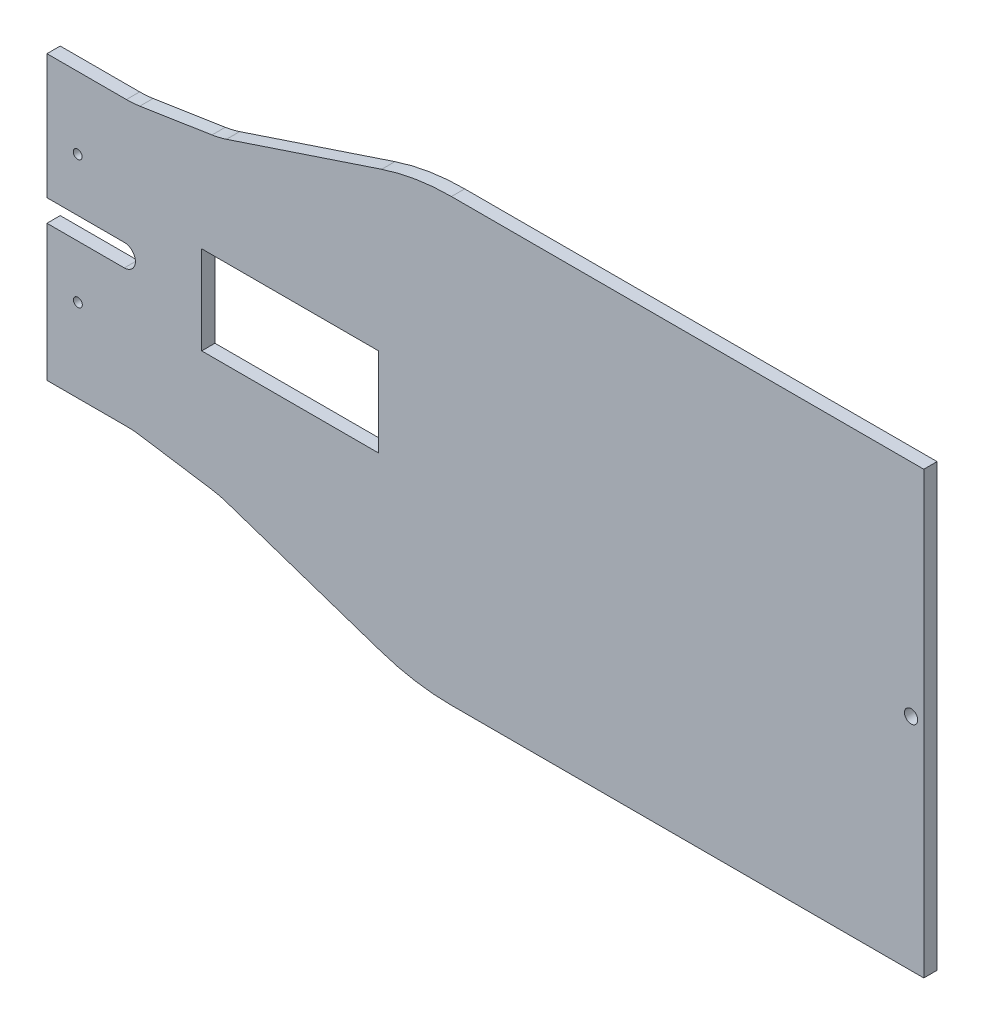
ISO-10303-21;
HEADER;
FILE_DESCRIPTION(('STEP AP214'),'2;1');
FILE_NAME('part.step','',(''),(''),'','','');
FILE_SCHEMA(('AUTOMOTIVE_DESIGN { 1 0 10303 214 1 1 1 1 }'));
ENDSEC;
DATA;
#1=APPLICATION_CONTEXT('core data for automotive mechanical design processes');
#2=APPLICATION_PROTOCOL_DEFINITION('international standard','automotive_design',2000,#1);
#3=PRODUCT_CONTEXT('',#1,'mechanical');
#4=PRODUCT('Part','Part','',(#3));
#5=PRODUCT_RELATED_PRODUCT_CATEGORY('part','',(#4));
#6=PRODUCT_DEFINITION_FORMATION('','',#4);
#7=PRODUCT_DEFINITION_CONTEXT('part definition',#1,'design');
#8=PRODUCT_DEFINITION('design','',#6,#7);
#9=PRODUCT_DEFINITION_SHAPE('','',#8);
#10=(LENGTH_UNIT() NAMED_UNIT(*) SI_UNIT(.MILLI.,.METRE.));
#11=(NAMED_UNIT(*) PLANE_ANGLE_UNIT() SI_UNIT($,.RADIAN.));
#12=(NAMED_UNIT(*) SI_UNIT($,.STERADIAN.) SOLID_ANGLE_UNIT());
#13=UNCERTAINTY_MEASURE_WITH_UNIT(LENGTH_MEASURE(1.E-05),#10,'distance_accuracy_value','');
#14=(GEOMETRIC_REPRESENTATION_CONTEXT(3) GLOBAL_UNCERTAINTY_ASSIGNED_CONTEXT((#13)) GLOBAL_UNIT_ASSIGNED_CONTEXT((#10,
#11,#12)) REPRESENTATION_CONTEXT('',''));
#15=CARTESIAN_POINT('',(0.,0.,0.));
#16=DIRECTION('',(0.,0.,1.));
#17=DIRECTION('',(1.,0.,0.));
#18=AXIS2_PLACEMENT_3D('',#15,#16,#17);
#19=CARTESIAN_POINT('',(-96.0516706232416,-19.0751877791471,3.));
#20=DIRECTION('',(1.,0.,0.));
#21=DIRECTION('',(0.,0.,-1.));
#22=AXIS2_PLACEMENT_3D('',#19,#20,#21);
#23=PLANE('',#22);
#24=DIRECTION('',(0.,0.,1.));
#25=VECTOR('',#24,1.);
#26=CARTESIAN_POINT('',(-96.0516706232416,9.70580950156895,0.));
#27=LINE('',#26,#25);
#28=CARTESIAN_POINT('',(-96.0516706232416,9.70580950156895,0.));
#29=VERTEX_POINT('',#28);
#30=CARTESIAN_POINT('',(-96.0516706232416,9.70580950156895,3.));
#31=VERTEX_POINT('',#30);
#32=EDGE_CURVE('E292',#29,#31,#27,.T.);
#33=ORIENTED_EDGE('',*,*,#32,.F.);
#34=DIRECTION('',(0.,-1.,0.));
#35=VECTOR('',#34,1.);
#36=CARTESIAN_POINT('',(-96.0516706232416,-19.0751877791471,0.));
#37=LINE('',#36,#35);
#38=CARTESIAN_POINT('',(-96.0516706232416,-21.0751877791471,0.));
#39=VERTEX_POINT('',#38);
#40=EDGE_CURVE('E358',#29,#39,#37,.T.);
#41=ORIENTED_EDGE('',*,*,#40,.T.);
#42=DIRECTION('',(0.,0.,-1.));
#43=VECTOR('',#42,1.);
#44=CARTESIAN_POINT('',(-96.0516706232416,-21.0751877791471,3.));
#45=LINE('',#44,#43);
#46=CARTESIAN_POINT('',(-96.0516706232416,-21.0751877791471,3.));
#47=VERTEX_POINT('',#46);
#48=EDGE_CURVE('E340',#47,#39,#45,.T.);
#49=ORIENTED_EDGE('',*,*,#48,.F.);
#50=DIRECTION('',(0.,-1.,0.));
#51=VECTOR('',#50,1.);
#52=CARTESIAN_POINT('',(-96.0516706232416,40.9248122208529,3.));
#53=LINE('',#52,#51);
#54=EDGE_CURVE('E324',#31,#47,#53,.T.);
#55=ORIENTED_EDGE('',*,*,#54,.F.);
#56=EDGE_LOOP('',(#33,#41,#49,#55));
#57=FACE_BOUND('',#56,.T.);
#58=ADVANCED_FACE('F42',(#57),#23,.F.);
#59=CARTESIAN_POINT('',(0.,0.,3.));
#60=DIRECTION('',(0.,0.,-1.));
#61=DIRECTION('',(-1.,0.,0.));
#62=AXIS2_PLACEMENT_3D('',#59,#60,#61);
#63=PLANE('',#62);
#64=DIRECTION('',(0.,1.,0.));
#65=VECTOR('',#64,1.);
#66=CARTESIAN_POINT('',(-21.0516706232416,22.205809501569,3.));
#67=LINE('',#66,#65);
#68=CARTESIAN_POINT('',(-21.0516706232416,2.20580950156895,3.));
#69=VERTEX_POINT('',#68);
#70=CARTESIAN_POINT('',(-21.0516706232416,22.205809501569,3.));
#71=VERTEX_POINT('',#70);
#72=EDGE_CURVE('E216',#69,#71,#67,.T.);
#73=ORIENTED_EDGE('',*,*,#72,.F.);
#74=DIRECTION('',(1.,0.,0.));
#75=VECTOR('',#74,1.);
#76=CARTESIAN_POINT('',(-61.0516706232416,2.20580950156895,3.));
#77=LINE('',#76,#75);
#78=CARTESIAN_POINT('',(-61.0516706232416,2.20580950156895,3.));
#79=VERTEX_POINT('',#78);
#80=EDGE_CURVE('E58',#79,#69,#77,.T.);
#81=ORIENTED_EDGE('',*,*,#80,.F.);
#82=DIRECTION('',(0.,-1.,0.));
#83=VECTOR('',#82,1.);
#84=CARTESIAN_POINT('',(-61.0516706232416,22.205809501569,3.));
#85=LINE('',#84,#83);
#86=CARTESIAN_POINT('',(-61.0516706232416,22.205809501569,3.));
#87=VERTEX_POINT('',#86);
#88=EDGE_CURVE('E224',#87,#79,#85,.T.);
#89=ORIENTED_EDGE('',*,*,#88,.F.);
#90=DIRECTION('',(-1.,0.,0.));
#91=VECTOR('',#90,1.);
#92=CARTESIAN_POINT('',(-61.0516706232416,22.205809501569,3.));
#93=LINE('',#92,#91);
#94=EDGE_CURVE('E206',#71,#87,#93,.T.);
#95=ORIENTED_EDGE('',*,*,#94,.F.);
#96=EDGE_LOOP('',(#73,#81,#89,#95));
#97=FACE_BOUND('',#96,.T.);
#98=CARTESIAN_POINT('',(99.4007219290605,10.8559718646317,3.));
#99=DIRECTION('',(0.,0.,1.));
#100=DIRECTION('',(1.,0.,0.));
#101=AXIS2_PLACEMENT_3D('',#98,#99,#100);
#102=CIRCLE('',#101,1.5);
#103=CARTESIAN_POINT('',(100.900721929061,10.8559718646317,3.));
#104=VERTEX_POINT('',#103);
#105=EDGE_CURVE('E234',#104,#104,#102,.T.);
#106=ORIENTED_EDGE('',*,*,#105,.F.);
#107=EDGE_LOOP('',(#106));
#108=FACE_BOUND('',#107,.T.);
#109=CARTESIAN_POINT('',(-89.0593788683811,-2.29416078946817,3.));
#110=DIRECTION('',(0.,0.,1.));
#111=DIRECTION('',(1.,0.,0.));
#112=AXIS2_PLACEMENT_3D('',#109,#110,#111);
#113=CIRCLE('',#112,0.999999999999998);
#114=CARTESIAN_POINT('',(-88.0593788683811,-2.29416078946817,3.));
#115=VERTEX_POINT('',#114);
#116=EDGE_CURVE('E259',#115,#115,#113,.T.);
#117=ORIENTED_EDGE('',*,*,#116,.F.);
#118=EDGE_LOOP('',(#117));
#119=FACE_BOUND('',#118,.T.);
#120=CARTESIAN_POINT('',(-89.102120747537,26.7045360832511,3.));
#121=DIRECTION('',(0.,0.,1.));
#122=DIRECTION('',(1.,0.,0.));
#123=AXIS2_PLACEMENT_3D('',#120,#121,#122);
#124=CIRCLE('',#123,0.999999999999998);
#125=CARTESIAN_POINT('',(-88.102120747537,26.7045360832511,3.));
#126=VERTEX_POINT('',#125);
#127=EDGE_CURVE('E253',#126,#126,#124,.T.);
#128=ORIENTED_EDGE('',*,*,#127,.F.);
#129=EDGE_LOOP('',(#128));
#130=FACE_BOUND('',#129,.T.);
#131=DIRECTION('',(1.,0.,0.));
#132=VECTOR('',#131,1.);
#133=CARTESIAN_POINT('',(-12.8148394892952,-38.9720930292842,3.));
#134=LINE('',#133,#132);
#135=CARTESIAN_POINT('',(-4.6220389624449,-38.9720930292842,3.));
#136=VERTEX_POINT('',#135);
#137=CARTESIAN_POINT('',(102.267029071877,-38.9720930292842,3.));
#138=VERTEX_POINT('',#137);
#139=EDGE_CURVE('E305',#136,#138,#134,.T.);
#140=ORIENTED_EDGE('',*,*,#139,.T.);
#141=DIRECTION('',(0.,-1.,0.));
#142=VECTOR('',#141,1.);
#143=CARTESIAN_POINT('',(102.267029071877,60.6840367585476,3.));
#144=LINE('',#143,#142);
#145=CARTESIAN_POINT('',(102.267029071877,60.6840367585476,3.));
#146=VERTEX_POINT('',#145);
#147=EDGE_CURVE('E243',#146,#138,#144,.T.);
#148=ORIENTED_EDGE('',*,*,#147,.F.);
#149=DIRECTION('',(-1.,0.,0.));
#150=VECTOR('',#149,1.);
#151=CARTESIAN_POINT('',(-12.6667795103413,60.6840367585476,3.));
#152=LINE('',#151,#150);
#153=CARTESIAN_POINT('',(-4.57149422754586,60.6840367585476,3.));
#154=VERTEX_POINT('',#153);
#155=EDGE_CURVE('E309',#146,#154,#152,.T.);
#156=ORIENTED_EDGE('',*,*,#155,.T.);
#157=CARTESIAN_POINT('',(-4.57149422754587,10.6840367585476,3.));
#158=DIRECTION('',(0.,0.,-1.));
#159=DIRECTION('',(-1.,0.,0.));
#160=AXIS2_PLACEMENT_3D('',#157,#158,#159);
#161=CIRCLE('',#160,50.);
#162=CARTESIAN_POINT('',(-20.3484950521654,58.1296503069037,3.));
#163=VERTEX_POINT('',#162);
#164=EDGE_CURVE('E399',#154,#163,#161,.F.);
#165=ORIENTED_EDGE('',*,*,#164,.T.);
#166=DIRECTION('',(-0.948912270967122,-0.315540016492391,0.));
#167=VECTOR('',#166,1.);
#168=CARTESIAN_POINT('',(-57.0516706232416,45.9248122208529,3.));
#169=LINE('',#168,#167);
#170=CARTESIAN_POINT('',(-55.4501411818536,46.4573658001565,3.));
#171=VERTEX_POINT('',#170);
#172=EDGE_CURVE('E313',#163,#171,#169,.T.);
#173=ORIENTED_EDGE('',*,*,#172,.T.);
#174=CARTESIAN_POINT('',(-61.7609415117014,65.4356112194989,3.));
#175=DIRECTION('',(0.,0.,-1.));
#176=DIRECTION('',(-1.,0.,0.));
#177=AXIS2_PLACEMENT_3D('',#174,#175,#176);
#178=CIRCLE('',#177,20.);
#179=CARTESIAN_POINT('',(-58.7197978266226,45.6681772664866,3.));
#180=VERTEX_POINT('',#179);
#181=EDGE_CURVE('E459',#171,#180,#178,.T.);
#182=ORIENTED_EDGE('',*,*,#181,.T.);
#183=DIRECTION('',(-0.988371697650617,-0.152057184253941,0.));
#184=VECTOR('',#183,1.);
#185=CARTESIAN_POINT('',(-76.5516706232416,42.9248122208529,3.));
#186=LINE('',#185,#184);
#187=CARTESIAN_POINT('',(-75.0399913178218,43.1573782678406,3.));
#188=VERTEX_POINT('',#187);
#189=EDGE_CURVE('E317',#180,#188,#186,.T.);
#190=ORIENTED_EDGE('',*,*,#189,.T.);
#191=CARTESIAN_POINT('',(-78.0811350029006,62.9248122208529,3.));
#192=DIRECTION('',(0.,0.,-1.));
#193=DIRECTION('',(-1.,0.,0.));
#194=AXIS2_PLACEMENT_3D('',#191,#192,#193);
#195=CIRCLE('',#194,20.);
#196=CARTESIAN_POINT('',(-78.0811350029006,42.9248122208529,3.));
#197=VERTEX_POINT('',#196);
#198=EDGE_CURVE('E453',#188,#197,#195,.T.);
#199=ORIENTED_EDGE('',*,*,#198,.T.);
#200=DIRECTION('',(-1.,0.,0.));
#201=VECTOR('',#200,1.);
#202=CARTESIAN_POINT('',(-96.0516706232416,42.9248122208529,3.));
#203=LINE('',#202,#201);
#204=CARTESIAN_POINT('',(-96.0516706232416,42.9248122208529,3.));
#205=VERTEX_POINT('',#204);
#206=EDGE_CURVE('E321',#197,#205,#203,.T.);
#207=ORIENTED_EDGE('',*,*,#206,.T.);
#208=CARTESIAN_POINT('',(-96.0516706232416,14.705809501569,3.));
#209=VERTEX_POINT('',#208);
#210=EDGE_CURVE('E325',#205,#209,#53,.T.);
#211=ORIENTED_EDGE('',*,*,#210,.T.);
#212=DIRECTION('',(-1.,0.,0.));
#213=VECTOR('',#212,1.);
#214=CARTESIAN_POINT('',(0.,14.705809501569,3.));
#215=LINE('',#214,#213);
#216=CARTESIAN_POINT('',(-78.5516706232416,14.705809501569,3.));
#217=VERTEX_POINT('',#216);
#218=EDGE_CURVE('E274',#217,#209,#215,.T.);
#219=ORIENTED_EDGE('',*,*,#218,.F.);
#220=CARTESIAN_POINT('',(-78.5516706232416,12.205809501569,3.));
#221=DIRECTION('',(0.,0.,1.));
#222=DIRECTION('',(1.,0.,0.));
#223=AXIS2_PLACEMENT_3D('',#220,#221,#222);
#224=CIRCLE('',#223,2.50000000000001);
#225=CARTESIAN_POINT('',(-78.5516706232416,9.70580950156895,3.));
#226=VERTEX_POINT('',#225);
#227=EDGE_CURVE('E286',#226,#217,#224,.T.);
#228=ORIENTED_EDGE('',*,*,#227,.F.);
#229=DIRECTION('',(-1.,0.,0.));
#230=VECTOR('',#229,1.);
#231=CARTESIAN_POINT('',(0.,9.70580950156896,3.));
#232=LINE('',#231,#230);
#233=EDGE_CURVE('E258',#226,#31,#232,.T.);
#234=ORIENTED_EDGE('',*,*,#233,.T.);
#235=ORIENTED_EDGE('',*,*,#54,.T.);
#236=DIRECTION('',(1.,0.,0.));
#237=VECTOR('',#236,1.);
#238=CARTESIAN_POINT('',(-96.0516706232416,-21.0751877791471,3.));
#239=LINE('',#238,#237);
#240=CARTESIAN_POINT('',(-78.0811350029006,-21.0751877791471,3.));
#241=VERTEX_POINT('',#240);
#242=EDGE_CURVE('E329',#47,#241,#239,.T.);
#243=ORIENTED_EDGE('',*,*,#242,.T.);
#244=CARTESIAN_POINT('',(-78.0811350029006,-41.0751877791471,3.));
#245=DIRECTION('',(0.,0.,-1.));
#246=DIRECTION('',(-1.,0.,0.));
#247=AXIS2_PLACEMENT_3D('',#244,#245,#246);
#248=CIRCLE('',#247,20.);
#249=CARTESIAN_POINT('',(-75.0399913178217,-21.3077538261348,3.));
#250=VERTEX_POINT('',#249);
#251=EDGE_CURVE('E441',#241,#250,#248,.T.);
#252=ORIENTED_EDGE('',*,*,#251,.T.);
#253=DIRECTION('',(0.988371697650617,-0.152057184253941,0.));
#254=VECTOR('',#253,1.);
#255=CARTESIAN_POINT('',(-57.0516706232416,-24.0751877791471,3.));
#256=LINE('',#255,#254);
#257=CARTESIAN_POINT('',(-58.7576275261902,-23.8127328710012,3.));
#258=VERTEX_POINT('',#257);
#259=EDGE_CURVE('E333',#250,#258,#256,.T.);
#260=ORIENTED_EDGE('',*,*,#259,.T.);
#261=CARTESIAN_POINT('',(-61.798771211269,-43.5801668240135,3.));
#262=DIRECTION('',(0.,0.,-1.));
#263=DIRECTION('',(-1.,0.,0.));
#264=AXIS2_PLACEMENT_3D('',#261,#262,#263);
#265=CIRCLE('',#264,20.);
#266=CARTESIAN_POINT('',(-55.415903089559,-24.6260381302207,3.));
#267=VERTEX_POINT('',#266);
#268=EDGE_CURVE('E447',#258,#267,#265,.T.);
#269=ORIENTED_EDGE('',*,*,#268,.T.);
#270=DIRECTION('',(0.947706434689638,-0.319143406085501,0.));
#271=VECTOR('',#270,1.);
#272=CARTESIAN_POINT('',(-57.0516706232416,-24.0751877791471,3.));
#273=LINE('',#272,#271);
#274=CARTESIAN_POINT('',(-20.5792092667199,-36.3574147637661,3.));
#275=VERTEX_POINT('',#274);
#276=EDGE_CURVE('E337',#267,#275,#273,.T.);
#277=ORIENTED_EDGE('',*,*,#276,.T.);
#278=CARTESIAN_POINT('',(-4.6220389624449,11.0279069707158,3.));
#279=DIRECTION('',(0.,0.,-1.));
#280=DIRECTION('',(-1.,0.,0.));
#281=AXIS2_PLACEMENT_3D('',#278,#279,#280);
#282=CIRCLE('',#281,50.);
#283=EDGE_CURVE('E396',#275,#136,#282,.F.);
#284=ORIENTED_EDGE('',*,*,#283,.T.);
#285=EDGE_LOOP('',(#140,#148,#156,#165,#173,#182,#190,#199,#207,#211,#219,#228,#234,#235,#243,
#252,#260,#269,#277,#284));
#286=FACE_BOUND('',#285,.T.);
#287=ADVANCED_FACE('F221',(#97,#108,#119,#130,#286),#63,.F.);
#288=CARTESIAN_POINT('',(0.,0.,0.));
#289=DIRECTION('',(0.,0.,-1.));
#290=DIRECTION('',(-1.,0.,0.));
#291=AXIS2_PLACEMENT_3D('',#288,#289,#290);
#292=PLANE('',#291);
#293=DIRECTION('',(-1.,0.,0.));
#294=VECTOR('',#293,1.);
#295=CARTESIAN_POINT('',(0.,2.20580950156895,0.));
#296=LINE('',#295,#294);
#297=CARTESIAN_POINT('',(-21.0516706232416,2.20580950156895,0.));
#298=VERTEX_POINT('',#297);
#299=CARTESIAN_POINT('',(-61.0516706232416,2.20580950156895,0.));
#300=VERTEX_POINT('',#299);
#301=EDGE_CURVE('E11',#298,#300,#296,.T.);
#302=ORIENTED_EDGE('',*,*,#301,.F.);
#303=DIRECTION('',(0.,-1.,0.));
#304=VECTOR('',#303,1.);
#305=CARTESIAN_POINT('',(-21.0516706232416,0.,0.));
#306=LINE('',#305,#304);
#307=CARTESIAN_POINT('',(-21.0516706232416,22.205809501569,0.));
#308=VERTEX_POINT('',#307);
#309=EDGE_CURVE('E466',#308,#298,#306,.T.);
#310=ORIENTED_EDGE('',*,*,#309,.F.);
#311=DIRECTION('',(1.,0.,0.));
#312=VECTOR('',#311,1.);
#313=CARTESIAN_POINT('',(0.,22.205809501569,0.));
#314=LINE('',#313,#312);
#315=CARTESIAN_POINT('',(-61.0516706232416,22.205809501569,0.));
#316=VERTEX_POINT('',#315);
#317=EDGE_CURVE('E209',#316,#308,#314,.T.);
#318=ORIENTED_EDGE('',*,*,#317,.F.);
#319=DIRECTION('',(0.,1.,0.));
#320=VECTOR('',#319,1.);
#321=CARTESIAN_POINT('',(-61.0516706232416,0.,0.));
#322=LINE('',#321,#320);
#323=EDGE_CURVE('E51',#300,#316,#322,.T.);
#324=ORIENTED_EDGE('',*,*,#323,.F.);
#325=EDGE_LOOP('',(#302,#310,#318,#324));
#326=FACE_BOUND('',#325,.T.);
#327=CARTESIAN_POINT('',(99.4007219290605,10.8559718646317,0.));
#328=DIRECTION('',(0.,0.,-1.));
#329=DIRECTION('',(-1.,0.,0.));
#330=AXIS2_PLACEMENT_3D('',#327,#328,#329);
#331=CIRCLE('',#330,1.5);
#332=CARTESIAN_POINT('',(97.9007219290605,10.8559718646317,0.));
#333=VERTEX_POINT('',#332);
#334=EDGE_CURVE('E242',#333,#333,#331,.T.);
#335=ORIENTED_EDGE('',*,*,#334,.F.);
#336=EDGE_LOOP('',(#335));
#337=FACE_BOUND('',#336,.T.);
#338=DIRECTION('',(0.,1.,0.));
#339=VECTOR('',#338,1.);
#340=CARTESIAN_POINT('',(102.267029071877,0.,0.));
#341=LINE('',#340,#339);
#342=CARTESIAN_POINT('',(102.267029071877,-38.9720930292842,0.));
#343=VERTEX_POINT('',#342);
#344=CARTESIAN_POINT('',(102.267029071877,60.6840367585476,0.));
#345=VERTEX_POINT('',#344);
#346=EDGE_CURVE('E250',#343,#345,#341,.T.);
#347=ORIENTED_EDGE('',*,*,#346,.F.);
#348=DIRECTION('',(1.,0.,0.));
#349=VECTOR('',#348,1.);
#350=CARTESIAN_POINT('',(-12.8148394892952,-38.9720930292842,0.));
#351=LINE('',#350,#349);
#352=CARTESIAN_POINT('',(-4.6220389624449,-38.9720930292842,0.));
#353=VERTEX_POINT('',#352);
#354=EDGE_CURVE('E295',#353,#343,#351,.T.);
#355=ORIENTED_EDGE('',*,*,#354,.F.);
#356=CARTESIAN_POINT('',(-4.6220389624449,11.0279069707158,0.));
#357=DIRECTION('',(0.,0.,-1.));
#358=DIRECTION('',(-1.,0.,0.));
#359=AXIS2_PLACEMENT_3D('',#356,#357,#358);
#360=CIRCLE('',#359,50.);
#361=CARTESIAN_POINT('',(-20.5792092667199,-36.3574147637661,0.));
#362=VERTEX_POINT('',#361);
#363=EDGE_CURVE('E384',#353,#362,#360,.T.);
#364=ORIENTED_EDGE('',*,*,#363,.T.);
#365=DIRECTION('',(0.947706434689638,-0.319143406085501,0.));
#366=VECTOR('',#365,1.);
#367=CARTESIAN_POINT('',(-57.0516706232416,-24.0751877791471,0.));
#368=LINE('',#367,#366);
#369=CARTESIAN_POINT('',(-55.415903089559,-24.6260381302207,0.));
#370=VERTEX_POINT('',#369);
#371=EDGE_CURVE('E310',#370,#362,#368,.T.);
#372=ORIENTED_EDGE('',*,*,#371,.F.);
#373=CARTESIAN_POINT('',(-61.798771211269,-43.5801668240135,0.));
#374=DIRECTION('',(0.,0.,-1.));
#375=DIRECTION('',(-1.,0.,0.));
#376=AXIS2_PLACEMENT_3D('',#373,#374,#375);
#377=CIRCLE('',#376,20.);
#378=CARTESIAN_POINT('',(-58.7576275261902,-23.8127328710012,0.));
#379=VERTEX_POINT('',#378);
#380=EDGE_CURVE('E444',#370,#379,#377,.F.);
#381=ORIENTED_EDGE('',*,*,#380,.T.);
#382=DIRECTION('',(0.988371697650617,-0.152057184253941,0.));
#383=VECTOR('',#382,1.);
#384=CARTESIAN_POINT('',(-57.0516706232416,-24.0751877791471,0.));
#385=LINE('',#384,#383);
#386=CARTESIAN_POINT('',(-75.0399913178217,-21.3077538261348,0.));
#387=VERTEX_POINT('',#386);
#388=EDGE_CURVE('E367',#387,#379,#385,.T.);
#389=ORIENTED_EDGE('',*,*,#388,.F.);
#390=CARTESIAN_POINT('',(-78.0811350029006,-41.0751877791471,0.));
#391=DIRECTION('',(0.,0.,-1.));
#392=DIRECTION('',(-1.,0.,0.));
#393=AXIS2_PLACEMENT_3D('',#390,#391,#392);
#394=CIRCLE('',#393,20.);
#395=CARTESIAN_POINT('',(-78.0811350029006,-21.0751877791471,0.));
#396=VERTEX_POINT('',#395);
#397=EDGE_CURVE('E438',#387,#396,#394,.F.);
#398=ORIENTED_EDGE('',*,*,#397,.T.);
#399=DIRECTION('',(1.,0.,0.));
#400=VECTOR('',#399,1.);
#401=CARTESIAN_POINT('',(-96.0516706232416,-21.0751877791471,0.));
#402=LINE('',#401,#400);
#403=EDGE_CURVE('E363',#39,#396,#402,.T.);
#404=ORIENTED_EDGE('',*,*,#403,.F.);
#405=ORIENTED_EDGE('',*,*,#40,.F.);
#406=DIRECTION('',(-1.,0.,0.));
#407=VECTOR('',#406,1.);
#408=CARTESIAN_POINT('',(0.,9.70580950156896,0.));
#409=LINE('',#408,#407);
#410=CARTESIAN_POINT('',(-78.5516706232416,9.70580950156895,0.));
#411=VERTEX_POINT('',#410);
#412=EDGE_CURVE('E270',#411,#29,#409,.T.);
#413=ORIENTED_EDGE('',*,*,#412,.F.);
#414=CARTESIAN_POINT('',(-78.5516706232416,12.205809501569,0.));
#415=DIRECTION('',(0.,0.,1.));
#416=DIRECTION('',(1.,0.,0.));
#417=AXIS2_PLACEMENT_3D('',#414,#415,#416);
#418=CIRCLE('',#417,2.50000000000001);
#419=CARTESIAN_POINT('',(-78.5516706232416,14.705809501569,0.));
#420=VERTEX_POINT('',#419);
#421=EDGE_CURVE('E273',#411,#420,#418,.T.);
#422=ORIENTED_EDGE('',*,*,#421,.T.);
#423=DIRECTION('',(-1.,0.,0.));
#424=VECTOR('',#423,1.);
#425=CARTESIAN_POINT('',(0.,14.705809501569,0.));
#426=LINE('',#425,#424);
#427=CARTESIAN_POINT('',(-96.0516706232416,14.705809501569,0.));
#428=VERTEX_POINT('',#427);
#429=EDGE_CURVE('E278',#420,#428,#426,.T.);
#430=ORIENTED_EDGE('',*,*,#429,.T.);
#431=CARTESIAN_POINT('',(-96.0516706232416,42.9248122208529,0.));
#432=VERTEX_POINT('',#431);
#433=EDGE_CURVE('E359',#432,#428,#37,.T.);
#434=ORIENTED_EDGE('',*,*,#433,.F.);
#435=DIRECTION('',(-1.,0.,0.));
#436=VECTOR('',#435,1.);
#437=CARTESIAN_POINT('',(-96.0516706232416,42.9248122208529,0.));
#438=LINE('',#437,#436);
#439=CARTESIAN_POINT('',(-78.0811350029006,42.9248122208529,0.));
#440=VERTEX_POINT('',#439);
#441=EDGE_CURVE('E355',#440,#432,#438,.T.);
#442=ORIENTED_EDGE('',*,*,#441,.F.);
#443=CARTESIAN_POINT('',(-78.0811350029006,62.9248122208529,0.));
#444=DIRECTION('',(0.,0.,-1.));
#445=DIRECTION('',(-1.,0.,0.));
#446=AXIS2_PLACEMENT_3D('',#443,#444,#445);
#447=CIRCLE('',#446,20.);
#448=CARTESIAN_POINT('',(-75.0399913178218,43.1573782678406,0.));
#449=VERTEX_POINT('',#448);
#450=EDGE_CURVE('E450',#440,#449,#447,.F.);
#451=ORIENTED_EDGE('',*,*,#450,.T.);
#452=DIRECTION('',(-0.988371697650617,-0.152057184253941,0.));
#453=VECTOR('',#452,1.);
#454=CARTESIAN_POINT('',(-76.5516706232416,42.9248122208529,0.));
#455=LINE('',#454,#453);
#456=CARTESIAN_POINT('',(-58.7197978266226,45.6681772664866,0.));
#457=VERTEX_POINT('',#456);
#458=EDGE_CURVE('E351',#457,#449,#455,.T.);
#459=ORIENTED_EDGE('',*,*,#458,.F.);
#460=CARTESIAN_POINT('',(-61.7609415117014,65.4356112194989,0.));
#461=DIRECTION('',(0.,0.,-1.));
#462=DIRECTION('',(-1.,0.,0.));
#463=AXIS2_PLACEMENT_3D('',#460,#461,#462);
#464=CIRCLE('',#463,20.);
#465=CARTESIAN_POINT('',(-55.4501411818536,46.4573658001565,0.));
#466=VERTEX_POINT('',#465);
#467=EDGE_CURVE('E456',#457,#466,#464,.F.);
#468=ORIENTED_EDGE('',*,*,#467,.T.);
#469=DIRECTION('',(-0.948912270967122,-0.315540016492391,0.));
#470=VECTOR('',#469,1.);
#471=CARTESIAN_POINT('',(-57.0516706232416,45.9248122208529,0.));
#472=LINE('',#471,#470);
#473=CARTESIAN_POINT('',(-20.3484950521654,58.1296503069037,0.));
#474=VERTEX_POINT('',#473);
#475=EDGE_CURVE('E347',#474,#466,#472,.T.);
#476=ORIENTED_EDGE('',*,*,#475,.F.);
#477=CARTESIAN_POINT('',(-4.57149422754587,10.6840367585476,0.));
#478=DIRECTION('',(0.,0.,-1.));
#479=DIRECTION('',(-1.,0.,0.));
#480=AXIS2_PLACEMENT_3D('',#477,#478,#479);
#481=CIRCLE('',#480,50.);
#482=CARTESIAN_POINT('',(-4.57149422754586,60.6840367585476,0.));
#483=VERTEX_POINT('',#482);
#484=EDGE_CURVE('E388',#474,#483,#481,.T.);
#485=ORIENTED_EDGE('',*,*,#484,.T.);
#486=DIRECTION('',(-1.,0.,0.));
#487=VECTOR('',#486,1.);
#488=CARTESIAN_POINT('',(-12.6667795103413,60.6840367585476,0.));
#489=LINE('',#488,#487);
#490=EDGE_CURVE('E344',#345,#483,#489,.T.);
#491=ORIENTED_EDGE('',*,*,#490,.F.);
#492=EDGE_LOOP('',(#347,#355,#364,#372,#381,#389,#398,#404,#405,#413,#422,#430,#434,#442,#451,
#459,#468,#476,#485,#491));
#493=FACE_BOUND('',#492,.T.);
#494=CARTESIAN_POINT('',(-89.0593788683811,-2.29416078946817,0.));
#495=DIRECTION('',(0.,0.,1.));
#496=DIRECTION('',(1.,0.,0.));
#497=AXIS2_PLACEMENT_3D('',#494,#495,#496);
#498=CIRCLE('',#497,0.999999999999998);
#499=CARTESIAN_POINT('',(-88.0593788683811,-2.29416078946817,0.));
#500=VERTEX_POINT('',#499);
#501=EDGE_CURVE('E254',#500,#500,#498,.T.);
#502=ORIENTED_EDGE('',*,*,#501,.T.);
#503=EDGE_LOOP('',(#502));
#504=FACE_BOUND('',#503,.T.);
#505=CARTESIAN_POINT('',(-89.102120747537,26.7045360832511,0.));
#506=DIRECTION('',(0.,0.,1.));
#507=DIRECTION('',(1.,0.,0.));
#508=AXIS2_PLACEMENT_3D('',#505,#506,#507);
#509=CIRCLE('',#508,0.999999999999998);
#510=CARTESIAN_POINT('',(-88.102120747537,26.7045360832511,0.));
#511=VERTEX_POINT('',#510);
#512=EDGE_CURVE('E263',#511,#511,#509,.T.);
#513=ORIENTED_EDGE('',*,*,#512,.T.);
#514=EDGE_LOOP('',(#513));
#515=FACE_BOUND('',#514,.T.);
#516=ADVANCED_FACE('F480',(#326,#337,#493,#504,#515),#292,.T.);
#517=CARTESIAN_POINT('',(-12.8148394892952,-38.9720930292842,3.));
#518=DIRECTION('',(0.,1.,0.));
#519=DIRECTION('',(0.,0.,1.));
#520=AXIS2_PLACEMENT_3D('',#517,#518,#519);
#521=PLANE('',#520);
#522=ORIENTED_EDGE('',*,*,#354,.T.);
#523=DIRECTION('',(0.,0.,1.));
#524=VECTOR('',#523,1.);
#525=CARTESIAN_POINT('',(102.267029071877,-38.9720930292842,-7.));
#526=LINE('',#525,#524);
#527=EDGE_CURVE('E246',#343,#138,#526,.T.);
#528=ORIENTED_EDGE('',*,*,#527,.T.);
#529=ORIENTED_EDGE('',*,*,#139,.F.);
#530=DIRECTION('',(0.,0.,-1.));
#531=VECTOR('',#530,1.);
#532=CARTESIAN_POINT('',(-4.6220389624449,-38.9720930292842,3.));
#533=LINE('',#532,#531);
#534=EDGE_CURVE('E402',#136,#353,#533,.T.);
#535=ORIENTED_EDGE('',*,*,#534,.T.);
#536=EDGE_LOOP('',(#522,#528,#529,#535));
#537=FACE_BOUND('',#536,.T.);
#538=ADVANCED_FACE('F570',(#537),#521,.F.);
#539=CARTESIAN_POINT('',(-12.6667795103413,60.6840367585476,3.));
#540=DIRECTION('',(0.,-1.,0.));
#541=DIRECTION('',(1.,0.,0.));
#542=AXIS2_PLACEMENT_3D('',#539,#540,#541);
#543=PLANE('',#542);
#544=ORIENTED_EDGE('',*,*,#155,.F.);
#545=DIRECTION('',(0.,0.,-1.));
#546=VECTOR('',#545,1.);
#547=CARTESIAN_POINT('',(102.267029071877,60.6840367585476,3.));
#548=LINE('',#547,#546);
#549=EDGE_CURVE('E462',#146,#345,#548,.T.);
#550=ORIENTED_EDGE('',*,*,#549,.T.);
#551=ORIENTED_EDGE('',*,*,#490,.T.);
#552=DIRECTION('',(0.,0.,-1.));
#553=VECTOR('',#552,1.);
#554=CARTESIAN_POINT('',(-4.57149422754586,60.6840367585476,3.));
#555=LINE('',#554,#553);
#556=EDGE_CURVE('E392',#483,#154,#555,.F.);
#557=ORIENTED_EDGE('',*,*,#556,.T.);
#558=EDGE_LOOP('',(#544,#550,#551,#557));
#559=FACE_BOUND('',#558,.T.);
#560=ADVANCED_FACE('F563',(#559),#543,.F.);
#561=CARTESIAN_POINT('',(-57.0516706232416,45.9248122208529,3.));
#562=DIRECTION('',(0.315540016492391,-0.948912270967122,0.));
#563=DIRECTION('',(0.948912270967122,0.315540016492391,0.));
#564=AXIS2_PLACEMENT_3D('',#561,#562,#563);
#565=PLANE('',#564);
#566=ORIENTED_EDGE('',*,*,#475,.T.);
#567=DIRECTION('',(0.,0.,-1.));
#568=VECTOR('',#567,1.);
#569=CARTESIAN_POINT('',(-55.4501411818536,46.4573658001565,3.));
#570=LINE('',#569,#568);
#571=EDGE_CURVE('E435',#466,#171,#570,.F.);
#572=ORIENTED_EDGE('',*,*,#571,.T.);
#573=ORIENTED_EDGE('',*,*,#172,.F.);
#574=DIRECTION('',(0.,0.,-1.));
#575=VECTOR('',#574,1.);
#576=CARTESIAN_POINT('',(-20.3484950521654,58.1296503069037,3.));
#577=LINE('',#576,#575);
#578=EDGE_CURVE('E380',#163,#474,#577,.T.);
#579=ORIENTED_EDGE('',*,*,#578,.T.);
#580=EDGE_LOOP('',(#566,#572,#573,#579));
#581=FACE_BOUND('',#580,.T.);
#582=ADVANCED_FACE('F552',(#581),#565,.F.);
#583=CARTESIAN_POINT('',(-76.5516706232416,42.9248122208529,3.));
#584=DIRECTION('',(0.152057184253941,-0.988371697650617,0.));
#585=DIRECTION('',(0.988371697650617,0.152057184253941,0.));
#586=AXIS2_PLACEMENT_3D('',#583,#584,#585);
#587=PLANE('',#586);
#588=ORIENTED_EDGE('',*,*,#458,.T.);
#589=DIRECTION('',(0.,0.,-1.));
#590=VECTOR('',#589,1.);
#591=CARTESIAN_POINT('',(-75.0399913178218,43.1573782678406,3.));
#592=LINE('',#591,#590);
#593=EDGE_CURVE('E432',#449,#188,#592,.F.);
#594=ORIENTED_EDGE('',*,*,#593,.T.);
#595=ORIENTED_EDGE('',*,*,#189,.F.);
#596=DIRECTION('',(0.,0.,-1.));
#597=VECTOR('',#596,1.);
#598=CARTESIAN_POINT('',(-58.7197978266226,45.6681772664866,0.));
#599=LINE('',#598,#597);
#600=EDGE_CURVE('E428',#180,#457,#599,.T.);
#601=ORIENTED_EDGE('',*,*,#600,.T.);
#602=EDGE_LOOP('',(#588,#594,#595,#601));
#603=FACE_BOUND('',#602,.T.);
#604=ADVANCED_FACE('F517',(#603),#587,.F.);
#605=CARTESIAN_POINT('',(-96.0516706232416,42.9248122208529,3.));
#606=DIRECTION('',(0.,-1.,0.));
#607=DIRECTION('',(0.,0.,-1.));
#608=AXIS2_PLACEMENT_3D('',#605,#606,#607);
#609=PLANE('',#608);
#610=ORIENTED_EDGE('',*,*,#206,.F.);
#611=DIRECTION('',(0.,0.,-1.));
#612=VECTOR('',#611,1.);
#613=CARTESIAN_POINT('',(-78.0811350029006,42.9248122208529,0.));
#614=LINE('',#613,#612);
#615=EDGE_CURVE('E424',#197,#440,#614,.T.);
#616=ORIENTED_EDGE('',*,*,#615,.T.);
#617=ORIENTED_EDGE('',*,*,#441,.T.);
#618=DIRECTION('',(0.,0.,-1.));
#619=VECTOR('',#618,1.);
#620=CARTESIAN_POINT('',(-96.0516706232416,42.9248122208529,3.));
#621=LINE('',#620,#619);
#622=EDGE_CURVE('E376',#205,#432,#621,.T.);
#623=ORIENTED_EDGE('',*,*,#622,.F.);
#624=EDGE_LOOP('',(#610,#616,#617,#623));
#625=FACE_BOUND('',#624,.T.);
#626=ADVANCED_FACE('F509',(#625),#609,.F.);
#627=ORIENTED_EDGE('',*,*,#433,.T.);
#628=DIRECTION('',(0.,0.,1.));
#629=VECTOR('',#628,1.);
#630=CARTESIAN_POINT('',(-96.0516706232416,14.705809501569,0.));
#631=LINE('',#630,#629);
#632=EDGE_CURVE('E296',#428,#209,#631,.T.);
#633=ORIENTED_EDGE('',*,*,#632,.T.);
#634=ORIENTED_EDGE('',*,*,#210,.F.);
#635=ORIENTED_EDGE('',*,*,#622,.T.);
#636=EDGE_LOOP('',(#627,#633,#634,#635));
#637=FACE_BOUND('',#636,.T.);
#638=ADVANCED_FACE('F499',(#637),#23,.F.);
#639=CARTESIAN_POINT('',(-96.0516706232416,-21.0751877791471,3.));
#640=DIRECTION('',(0.,1.,0.));
#641=DIRECTION('',(0.,0.,1.));
#642=AXIS2_PLACEMENT_3D('',#639,#640,#641);
#643=PLANE('',#642);
#644=ORIENTED_EDGE('',*,*,#403,.T.);
#645=DIRECTION('',(0.,0.,-1.));
#646=VECTOR('',#645,1.);
#647=CARTESIAN_POINT('',(-78.0811350029006,-21.0751877791471,3.));
#648=LINE('',#647,#646);
#649=EDGE_CURVE('E417',#396,#241,#648,.F.);
#650=ORIENTED_EDGE('',*,*,#649,.T.);
#651=ORIENTED_EDGE('',*,*,#242,.F.);
#652=ORIENTED_EDGE('',*,*,#48,.T.);
#653=EDGE_LOOP('',(#644,#650,#651,#652));
#654=FACE_BOUND('',#653,.T.);
#655=ADVANCED_FACE('F508',(#654),#643,.F.);
#656=CARTESIAN_POINT('',(-57.0516706232416,-24.0751877791471,3.));
#657=DIRECTION('',(0.152057184253941,0.988371697650617,0.));
#658=DIRECTION('',(-0.988371697650617,0.152057184253941,0.));
#659=AXIS2_PLACEMENT_3D('',#656,#657,#658);
#660=PLANE('',#659);
#661=ORIENTED_EDGE('',*,*,#259,.F.);
#662=DIRECTION('',(0.,0.,-1.));
#663=VECTOR('',#662,1.);
#664=CARTESIAN_POINT('',(-75.0399913178217,-21.3077538261348,0.));
#665=LINE('',#664,#663);
#666=EDGE_CURVE('E413',#250,#387,#665,.T.);
#667=ORIENTED_EDGE('',*,*,#666,.T.);
#668=ORIENTED_EDGE('',*,*,#388,.T.);
#669=DIRECTION('',(0.,0.,-1.));
#670=VECTOR('',#669,1.);
#671=CARTESIAN_POINT('',(-58.7576275261902,-23.8127328710012,3.));
#672=LINE('',#671,#670);
#673=EDGE_CURVE('E410',#379,#258,#672,.F.);
#674=ORIENTED_EDGE('',*,*,#673,.T.);
#675=EDGE_LOOP('',(#661,#667,#668,#674));
#676=FACE_BOUND('',#675,.T.);
#677=ADVANCED_FACE('F515',(#676),#660,.F.);
#678=CARTESIAN_POINT('',(-57.0516706232416,-24.0751877791471,3.));
#679=DIRECTION('',(0.319143406085501,0.947706434689638,0.));
#680=DIRECTION('',(-0.947706434689638,0.319143406085501,0.));
#681=AXIS2_PLACEMENT_3D('',#678,#679,#680);
#682=PLANE('',#681);
#683=ORIENTED_EDGE('',*,*,#276,.F.);
#684=DIRECTION('',(0.,0.,-1.));
#685=VECTOR('',#684,1.);
#686=CARTESIAN_POINT('',(-55.415903089559,-24.6260381302207,0.));
#687=LINE('',#686,#685);
#688=EDGE_CURVE('E420',#267,#370,#687,.T.);
#689=ORIENTED_EDGE('',*,*,#688,.T.);
#690=ORIENTED_EDGE('',*,*,#371,.T.);
#691=DIRECTION('',(0.,0.,-1.));
#692=VECTOR('',#691,1.);
#693=CARTESIAN_POINT('',(-20.5792092667199,-36.3574147637661,3.));
#694=LINE('',#693,#692);
#695=EDGE_CURVE('E406',#362,#275,#694,.F.);
#696=ORIENTED_EDGE('',*,*,#695,.T.);
#697=EDGE_LOOP('',(#683,#689,#690,#696));
#698=FACE_BOUND('',#697,.T.);
#699=ADVANCED_FACE('F578',(#698),#682,.F.);
#700=CARTESIAN_POINT('',(-4.57149422754587,10.6840367585476,3.));
#701=DIRECTION('',(0.,0.,-1.));
#702=DIRECTION('',(-1.,0.,0.));
#703=AXIS2_PLACEMENT_3D('',#700,#701,#702);
#704=CYLINDRICAL_SURFACE('',#703,50.);
#705=ORIENTED_EDGE('',*,*,#164,.F.);
#706=ORIENTED_EDGE('',*,*,#556,.F.);
#707=ORIENTED_EDGE('',*,*,#484,.F.);
#708=ORIENTED_EDGE('',*,*,#578,.F.);
#709=EDGE_LOOP('',(#705,#706,#707,#708));
#710=FACE_BOUND('',#709,.T.);
#711=ADVANCED_FACE('F557',(#710),#704,.T.);
#712=CARTESIAN_POINT('',(-4.6220389624449,11.0279069707158,3.));
#713=DIRECTION('',(0.,0.,-1.));
#714=DIRECTION('',(-1.,0.,0.));
#715=AXIS2_PLACEMENT_3D('',#712,#713,#714);
#716=CYLINDRICAL_SURFACE('',#715,50.);
#717=ORIENTED_EDGE('',*,*,#283,.F.);
#718=ORIENTED_EDGE('',*,*,#695,.F.);
#719=ORIENTED_EDGE('',*,*,#363,.F.);
#720=ORIENTED_EDGE('',*,*,#534,.F.);
#721=EDGE_LOOP('',(#717,#718,#719,#720));
#722=FACE_BOUND('',#721,.T.);
#723=ADVANCED_FACE('F572',(#722),#716,.T.);
#724=CARTESIAN_POINT('',(-78.0811350029006,-41.0751877791471,3.));
#725=DIRECTION('',(0.,0.,1.));
#726=DIRECTION('',(1.,0.,0.));
#727=AXIS2_PLACEMENT_3D('',#724,#725,#726);
#728=CYLINDRICAL_SURFACE('',#727,20.);
#729=ORIENTED_EDGE('',*,*,#251,.F.);
#730=ORIENTED_EDGE('',*,*,#649,.F.);
#731=ORIENTED_EDGE('',*,*,#397,.F.);
#732=ORIENTED_EDGE('',*,*,#666,.F.);
#733=EDGE_LOOP('',(#729,#730,#731,#732));
#734=FACE_BOUND('',#733,.T.);
#735=ADVANCED_FACE('F591',(#734),#728,.F.);
#736=CARTESIAN_POINT('',(-61.798771211269,-43.5801668240135,3.));
#737=DIRECTION('',(0.,0.,1.));
#738=DIRECTION('',(1.,0.,0.));
#739=AXIS2_PLACEMENT_3D('',#736,#737,#738);
#740=CYLINDRICAL_SURFACE('',#739,20.);
#741=ORIENTED_EDGE('',*,*,#268,.F.);
#742=ORIENTED_EDGE('',*,*,#673,.F.);
#743=ORIENTED_EDGE('',*,*,#380,.F.);
#744=ORIENTED_EDGE('',*,*,#688,.F.);
#745=EDGE_LOOP('',(#741,#742,#743,#744));
#746=FACE_BOUND('',#745,.T.);
#747=ADVANCED_FACE('F582',(#746),#740,.F.);
#748=CARTESIAN_POINT('',(-78.0811350029006,62.9248122208529,3.));
#749=DIRECTION('',(0.,0.,1.));
#750=DIRECTION('',(1.,0.,0.));
#751=AXIS2_PLACEMENT_3D('',#748,#749,#750);
#752=CYLINDRICAL_SURFACE('',#751,20.);
#753=ORIENTED_EDGE('',*,*,#198,.F.);
#754=ORIENTED_EDGE('',*,*,#593,.F.);
#755=ORIENTED_EDGE('',*,*,#450,.F.);
#756=ORIENTED_EDGE('',*,*,#615,.F.);
#757=EDGE_LOOP('',(#753,#754,#755,#756));
#758=FACE_BOUND('',#757,.T.);
#759=ADVANCED_FACE('F541',(#758),#752,.F.);
#760=CARTESIAN_POINT('',(-61.7609415117014,65.4356112194989,3.));
#761=DIRECTION('',(0.,0.,1.));
#762=DIRECTION('',(1.,0.,0.));
#763=AXIS2_PLACEMENT_3D('',#760,#761,#762);
#764=CYLINDRICAL_SURFACE('',#763,20.);
#765=ORIENTED_EDGE('',*,*,#181,.F.);
#766=ORIENTED_EDGE('',*,*,#571,.F.);
#767=ORIENTED_EDGE('',*,*,#467,.F.);
#768=ORIENTED_EDGE('',*,*,#600,.F.);
#769=EDGE_LOOP('',(#765,#766,#767,#768));
#770=FACE_BOUND('',#769,.T.);
#771=ADVANCED_FACE('F44',(#770),#764,.F.);
#772=CARTESIAN_POINT('',(0.,9.70580950156896,0.));
#773=DIRECTION('',(0.,1.,0.));
#774=DIRECTION('',(-1.,0.,0.));
#775=AXIS2_PLACEMENT_3D('',#772,#773,#774);
#776=PLANE('',#775);
#777=ORIENTED_EDGE('',*,*,#233,.F.);
#778=DIRECTION('',(0.,0.,1.));
#779=VECTOR('',#778,1.);
#780=CARTESIAN_POINT('',(-78.5516706232416,9.70580950156895,0.));
#781=LINE('',#780,#779);
#782=EDGE_CURVE('E282',#411,#226,#781,.T.);
#783=ORIENTED_EDGE('',*,*,#782,.F.);
#784=ORIENTED_EDGE('',*,*,#412,.T.);
#785=ORIENTED_EDGE('',*,*,#32,.T.);
#786=EDGE_LOOP('',(#777,#783,#784,#785));
#787=FACE_BOUND('',#786,.T.);
#788=ADVANCED_FACE('F599',(#787),#776,.T.);
#789=CARTESIAN_POINT('',(0.,14.705809501569,0.));
#790=DIRECTION('',(0.,1.,0.));
#791=DIRECTION('',(-1.,0.,0.));
#792=AXIS2_PLACEMENT_3D('',#789,#790,#791);
#793=PLANE('',#792);
#794=ORIENTED_EDGE('',*,*,#218,.T.);
#795=ORIENTED_EDGE('',*,*,#632,.F.);
#796=ORIENTED_EDGE('',*,*,#429,.F.);
#797=DIRECTION('',(0.,0.,1.));
#798=VECTOR('',#797,1.);
#799=CARTESIAN_POINT('',(-78.5516706232416,14.705809501569,0.));
#800=LINE('',#799,#798);
#801=EDGE_CURVE('E300',#420,#217,#800,.T.);
#802=ORIENTED_EDGE('',*,*,#801,.T.);
#803=EDGE_LOOP('',(#794,#795,#796,#802));
#804=FACE_BOUND('',#803,.T.);
#805=ADVANCED_FACE('F530',(#804),#793,.F.);
#806=CARTESIAN_POINT('',(-78.5516706232416,12.205809501569,0.));
#807=DIRECTION('',(0.,0.,1.));
#808=DIRECTION('',(1.,0.,0.));
#809=AXIS2_PLACEMENT_3D('',#806,#807,#808);
#810=CYLINDRICAL_SURFACE('',#809,2.50000000000001);
#811=ORIENTED_EDGE('',*,*,#227,.T.);
#812=ORIENTED_EDGE('',*,*,#801,.F.);
#813=ORIENTED_EDGE('',*,*,#421,.F.);
#814=ORIENTED_EDGE('',*,*,#782,.T.);
#815=EDGE_LOOP('',(#811,#812,#813,#814));
#816=FACE_BOUND('',#815,.T.);
#817=ADVANCED_FACE('F532',(#816),#810,.F.);
#818=CARTESIAN_POINT('',(-89.102120747537,26.7045360832511,0.));
#819=DIRECTION('',(0.,0.,1.));
#820=DIRECTION('',(1.,0.,0.));
#821=AXIS2_PLACEMENT_3D('',#818,#819,#820);
#822=CYLINDRICAL_SURFACE('',#821,0.999999999999998);
#823=ORIENTED_EDGE('',*,*,#512,.F.);
#824=EDGE_LOOP('',(#823));
#825=FACE_BOUND('',#824,.T.);
#826=ORIENTED_EDGE('',*,*,#127,.T.);
#827=EDGE_LOOP('',(#826));
#828=FACE_BOUND('',#827,.T.);
#829=ADVANCED_FACE('F690',(#825,#828),#822,.F.);
#830=CARTESIAN_POINT('',(-89.0593788683811,-2.29416078946817,0.));
#831=DIRECTION('',(0.,0.,1.));
#832=DIRECTION('',(1.,0.,0.));
#833=AXIS2_PLACEMENT_3D('',#830,#831,#832);
#834=CYLINDRICAL_SURFACE('',#833,0.999999999999998);
#835=ORIENTED_EDGE('',*,*,#501,.F.);
#836=EDGE_LOOP('',(#835));
#837=FACE_BOUND('',#836,.T.);
#838=ORIENTED_EDGE('',*,*,#116,.T.);
#839=EDGE_LOOP('',(#838));
#840=FACE_BOUND('',#839,.T.);
#841=ADVANCED_FACE('F699',(#837,#840),#834,.F.);
#842=CARTESIAN_POINT('',(102.267029071877,60.6840367585476,-7.));
#843=DIRECTION('',(-1.,0.,0.));
#844=DIRECTION('',(0.,-1.,0.));
#845=AXIS2_PLACEMENT_3D('',#842,#843,#844);
#846=PLANE('',#845);
#847=ORIENTED_EDGE('',*,*,#346,.T.);
#848=ORIENTED_EDGE('',*,*,#549,.F.);
#849=ORIENTED_EDGE('',*,*,#147,.T.);
#850=ORIENTED_EDGE('',*,*,#527,.F.);
#851=EDGE_LOOP('',(#847,#848,#849,#850));
#852=FACE_BOUND('',#851,.T.);
#853=ADVANCED_FACE('F492',(#852),#846,.F.);
#854=CARTESIAN_POINT('',(99.4007219290605,10.8559718646317,-7.));
#855=DIRECTION('',(0.,0.,1.));
#856=DIRECTION('',(1.,0.,0.));
#857=AXIS2_PLACEMENT_3D('',#854,#855,#856);
#858=CYLINDRICAL_SURFACE('',#857,1.5);
#859=ORIENTED_EDGE('',*,*,#334,.T.);
#860=EDGE_LOOP('',(#859));
#861=FACE_BOUND('',#860,.T.);
#862=ORIENTED_EDGE('',*,*,#105,.T.);
#863=EDGE_LOOP('',(#862));
#864=FACE_BOUND('',#863,.T.);
#865=ADVANCED_FACE('F485',(#861,#864),#858,.F.);
#866=CARTESIAN_POINT('',(-61.0516706232416,2.20580950156895,-7.));
#867=DIRECTION('',(0.,-1.,0.));
#868=DIRECTION('',(0.,0.,-1.));
#869=AXIS2_PLACEMENT_3D('',#866,#867,#868);
#870=PLANE('',#869);
#871=ORIENTED_EDGE('',*,*,#301,.T.);
#872=DIRECTION('',(0.,0.,1.));
#873=VECTOR('',#872,1.);
#874=CARTESIAN_POINT('',(-61.0516706232416,2.20580950156895,-7.));
#875=LINE('',#874,#873);
#876=EDGE_CURVE('E231',#300,#79,#875,.T.);
#877=ORIENTED_EDGE('',*,*,#876,.T.);
#878=ORIENTED_EDGE('',*,*,#80,.T.);
#879=DIRECTION('',(0.,0.,1.));
#880=VECTOR('',#879,1.);
#881=CARTESIAN_POINT('',(-21.0516706232416,2.20580950156895,-7.));
#882=LINE('',#881,#880);
#883=EDGE_CURVE('E213',#298,#69,#882,.T.);
#884=ORIENTED_EDGE('',*,*,#883,.F.);
#885=EDGE_LOOP('',(#871,#877,#878,#884));
#886=FACE_BOUND('',#885,.T.);
#887=ADVANCED_FACE('F482',(#886),#870,.F.);
#888=CARTESIAN_POINT('',(-61.0516706232416,22.205809501569,-7.));
#889=DIRECTION('',(-1.,0.,0.));
#890=DIRECTION('',(0.,0.,1.));
#891=AXIS2_PLACEMENT_3D('',#888,#889,#890);
#892=PLANE('',#891);
#893=ORIENTED_EDGE('',*,*,#323,.T.);
#894=DIRECTION('',(0.,0.,1.));
#895=VECTOR('',#894,1.);
#896=CARTESIAN_POINT('',(-61.0516706232416,22.205809501569,-7.));
#897=LINE('',#896,#895);
#898=EDGE_CURVE('E212',#316,#87,#897,.T.);
#899=ORIENTED_EDGE('',*,*,#898,.T.);
#900=ORIENTED_EDGE('',*,*,#88,.T.);
#901=ORIENTED_EDGE('',*,*,#876,.F.);
#902=EDGE_LOOP('',(#893,#899,#900,#901));
#903=FACE_BOUND('',#902,.T.);
#904=ADVANCED_FACE('F477',(#903),#892,.F.);
#905=CARTESIAN_POINT('',(-61.0516706232416,22.205809501569,-7.));
#906=DIRECTION('',(0.,1.,0.));
#907=DIRECTION('',(0.,0.,1.));
#908=AXIS2_PLACEMENT_3D('',#905,#906,#907);
#909=PLANE('',#908);
#910=ORIENTED_EDGE('',*,*,#317,.T.);
#911=DIRECTION('',(0.,0.,1.));
#912=VECTOR('',#911,1.);
#913=CARTESIAN_POINT('',(-21.0516706232416,22.205809501569,-7.));
#914=LINE('',#913,#912);
#915=EDGE_CURVE('E66',#308,#71,#914,.T.);
#916=ORIENTED_EDGE('',*,*,#915,.T.);
#917=ORIENTED_EDGE('',*,*,#94,.T.);
#918=ORIENTED_EDGE('',*,*,#898,.F.);
#919=EDGE_LOOP('',(#910,#916,#917,#918));
#920=FACE_BOUND('',#919,.T.);
#921=ADVANCED_FACE('F203',(#920),#909,.F.);
#922=CARTESIAN_POINT('',(-21.0516706232416,22.205809501569,-7.));
#923=DIRECTION('',(1.,0.,0.));
#924=DIRECTION('',(0.,0.,-1.));
#925=AXIS2_PLACEMENT_3D('',#922,#923,#924);
#926=PLANE('',#925);
#927=ORIENTED_EDGE('',*,*,#309,.T.);
#928=ORIENTED_EDGE('',*,*,#883,.T.);
#929=ORIENTED_EDGE('',*,*,#72,.T.);
#930=ORIENTED_EDGE('',*,*,#915,.F.);
#931=EDGE_LOOP('',(#927,#928,#929,#930));
#932=FACE_BOUND('',#931,.T.);
#933=ADVANCED_FACE('F217',(#932),#926,.F.);
#934=CLOSED_SHELL('',(#58,#287,#516,#538,#560,#582,#604,#626,#638,#655,#677,#699,#711,#723,#735,
#747,#759,#771,#788,#805,#817,#829,#841,#853,#865,#887,#904,#921,#933));
#935=MANIFOLD_SOLID_BREP('B2',#934);
#936=ADVANCED_BREP_SHAPE_REPRESENTATION('',(#18,#935),#14);
#937=SHAPE_DEFINITION_REPRESENTATION(#9,#936);
ENDSEC;
END-ISO-10303-21;
